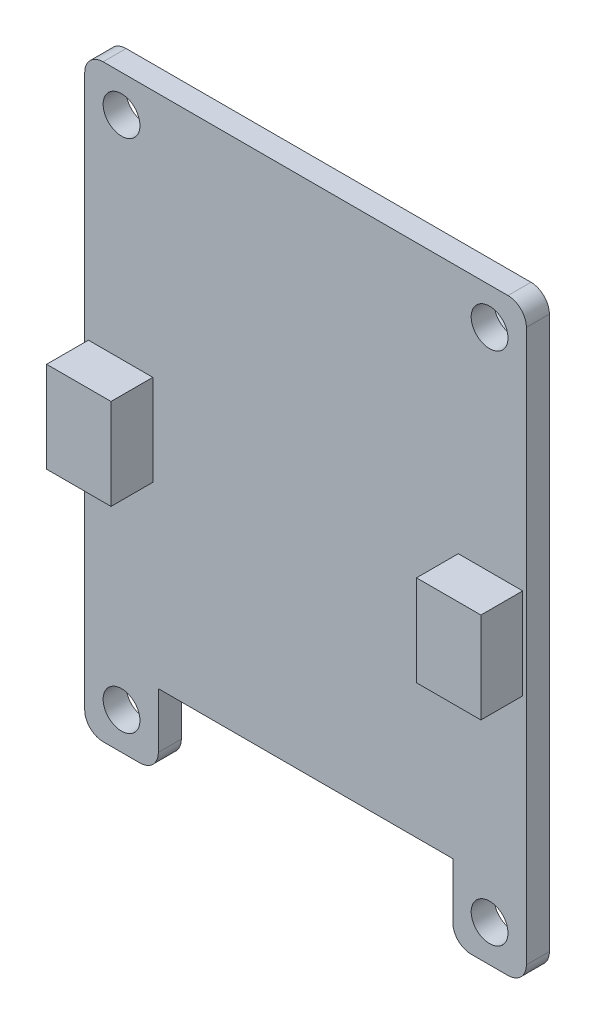
ISO-10303-21;
HEADER;
FILE_DESCRIPTION(('STEP AP214'),'2;1');
FILE_NAME('part.step','',(''),(''),'','','');
FILE_SCHEMA(('AUTOMOTIVE_DESIGN { 1 0 10303 214 1 1 1 1 }'));
ENDSEC;
DATA;
#1=APPLICATION_CONTEXT('core data for automotive mechanical design processes');
#2=APPLICATION_PROTOCOL_DEFINITION('international standard','automotive_design',2000,#1);
#3=PRODUCT_CONTEXT('',#1,'mechanical');
#4=PRODUCT('Part','Part','',(#3));
#5=PRODUCT_RELATED_PRODUCT_CATEGORY('part','',(#4));
#6=PRODUCT_DEFINITION_FORMATION('','',#4);
#7=PRODUCT_DEFINITION_CONTEXT('part definition',#1,'design');
#8=PRODUCT_DEFINITION('design','',#6,#7);
#9=PRODUCT_DEFINITION_SHAPE('','',#8);
#10=(LENGTH_UNIT() NAMED_UNIT(*) SI_UNIT(.MILLI.,.METRE.));
#11=(NAMED_UNIT(*) PLANE_ANGLE_UNIT() SI_UNIT($,.RADIAN.));
#12=(NAMED_UNIT(*) SI_UNIT($,.STERADIAN.) SOLID_ANGLE_UNIT());
#13=UNCERTAINTY_MEASURE_WITH_UNIT(LENGTH_MEASURE(1.E-05),#10,'distance_accuracy_value','');
#14=(GEOMETRIC_REPRESENTATION_CONTEXT(3) GLOBAL_UNCERTAINTY_ASSIGNED_CONTEXT((#13)) GLOBAL_UNIT_ASSIGNED_CONTEXT((#10,
#11,#12)) REPRESENTATION_CONTEXT('',''));
#15=CARTESIAN_POINT('',(0.,0.,0.));
#16=DIRECTION('',(0.,0.,1.));
#17=DIRECTION('',(1.,0.,0.));
#18=AXIS2_PLACEMENT_3D('',#15,#16,#17);
#19=CARTESIAN_POINT('',(0.,0.,1.5875));
#20=DIRECTION('',(0.,0.,-1.));
#21=DIRECTION('',(-1.,0.,0.));
#22=AXIS2_PLACEMENT_3D('',#19,#20,#21);
#23=PLANE('',#22);
#24=DIRECTION('',(0.,1.,0.));
#25=VECTOR('',#24,1.);
#26=CARTESIAN_POINT('',(-10.541,3.175,1.5875));
#27=LINE('',#26,#25);
#28=CARTESIAN_POINT('',(-10.541,-3.0988,1.5875));
#29=VERTEX_POINT('',#28);
#30=CARTESIAN_POINT('',(-10.541,3.175,1.5875));
#31=VERTEX_POINT('',#30);
#32=EDGE_CURVE('E221',#29,#31,#27,.T.);
#33=ORIENTED_EDGE('',*,*,#32,.F.);
#34=DIRECTION('',(1.,0.,0.));
#35=VECTOR('',#34,1.);
#36=CARTESIAN_POINT('',(-14.986,-3.0988,1.5875));
#37=LINE('',#36,#35);
#38=CARTESIAN_POINT('',(-14.986,-3.0988,1.5875));
#39=VERTEX_POINT('',#38);
#40=EDGE_CURVE('E264',#39,#29,#37,.T.);
#41=ORIENTED_EDGE('',*,*,#40,.F.);
#42=DIRECTION('',(0.,-1.,0.));
#43=VECTOR('',#42,1.);
#44=CARTESIAN_POINT('',(-14.986,3.175,1.5875));
#45=LINE('',#44,#43);
#46=CARTESIAN_POINT('',(-14.986,3.175,1.5875));
#47=VERTEX_POINT('',#46);
#48=EDGE_CURVE('E281',#47,#39,#45,.T.);
#49=ORIENTED_EDGE('',*,*,#48,.F.);
#50=DIRECTION('',(-1.,0.,0.));
#51=VECTOR('',#50,1.);
#52=CARTESIAN_POINT('',(-14.986,3.175,1.5875));
#53=LINE('',#52,#51);
#54=EDGE_CURVE('E277',#31,#47,#53,.T.);
#55=ORIENTED_EDGE('',*,*,#54,.F.);
#56=EDGE_LOOP('',(#33,#41,#49,#55));
#57=FACE_BOUND('',#56,.T.);
#58=DIRECTION('',(0.,-1.,0.));
#59=VECTOR('',#58,1.);
#60=CARTESIAN_POINT('',(10.16,-20.32,1.5875));
#61=LINE('',#60,#59);
#62=CARTESIAN_POINT('',(10.16,-15.24,1.5875));
#63=VERTEX_POINT('',#62);
#64=CARTESIAN_POINT('',(10.16,-19.05,1.5875));
#65=VERTEX_POINT('',#64);
#66=EDGE_CURVE('E394',#63,#65,#61,.T.);
#67=ORIENTED_EDGE('',*,*,#66,.T.);
#68=CARTESIAN_POINT('',(11.43,-19.05,1.5875));
#69=DIRECTION('',(0.,0.,-1.));
#70=DIRECTION('',(-1.,0.,0.));
#71=AXIS2_PLACEMENT_3D('',#68,#69,#70);
#72=CIRCLE('',#71,1.27);
#73=CARTESIAN_POINT('',(11.43,-20.32,1.5875));
#74=VERTEX_POINT('',#73);
#75=EDGE_CURVE('E486',#65,#74,#72,.F.);
#76=ORIENTED_EDGE('',*,*,#75,.T.);
#77=DIRECTION('',(1.,0.,0.));
#78=VECTOR('',#77,1.);
#79=CARTESIAN_POINT('',(15.24,-20.32,1.5875));
#80=LINE('',#79,#78);
#81=CARTESIAN_POINT('',(13.97,-20.32,1.5875));
#82=VERTEX_POINT('',#81);
#83=EDGE_CURVE('E398',#74,#82,#80,.T.);
#84=ORIENTED_EDGE('',*,*,#83,.T.);
#85=CARTESIAN_POINT('',(13.97,-19.05,1.5875));
#86=DIRECTION('',(0.,0.,-1.));
#87=DIRECTION('',(-1.,0.,0.));
#88=AXIS2_PLACEMENT_3D('',#85,#86,#87);
#89=CIRCLE('',#88,1.27);
#90=CARTESIAN_POINT('',(15.24,-19.05,1.5875));
#91=VERTEX_POINT('',#90);
#92=EDGE_CURVE('E474',#82,#91,#89,.F.);
#93=ORIENTED_EDGE('',*,*,#92,.T.);
#94=DIRECTION('',(0.,1.,0.));
#95=VECTOR('',#94,1.);
#96=CARTESIAN_POINT('',(15.24,20.32,1.5875));
#97=LINE('',#96,#95);
#98=CARTESIAN_POINT('',(15.24,19.05,1.5875));
#99=VERTEX_POINT('',#98);
#100=EDGE_CURVE('E402',#91,#99,#97,.T.);
#101=ORIENTED_EDGE('',*,*,#100,.T.);
#102=CARTESIAN_POINT('',(13.97,19.05,1.5875));
#103=DIRECTION('',(0.,0.,-1.));
#104=DIRECTION('',(-1.,0.,0.));
#105=AXIS2_PLACEMENT_3D('',#102,#103,#104);
#106=CIRCLE('',#105,1.27);
#107=CARTESIAN_POINT('',(13.97,20.32,1.5875));
#108=VERTEX_POINT('',#107);
#109=EDGE_CURVE('E471',#99,#108,#106,.F.);
#110=ORIENTED_EDGE('',*,*,#109,.T.);
#111=DIRECTION('',(-1.,0.,0.));
#112=VECTOR('',#111,1.);
#113=CARTESIAN_POINT('',(-15.24,20.32,1.5875));
#114=LINE('',#113,#112);
#115=CARTESIAN_POINT('',(-13.97,20.32,1.5875));
#116=VERTEX_POINT('',#115);
#117=EDGE_CURVE('E406',#108,#116,#114,.T.);
#118=ORIENTED_EDGE('',*,*,#117,.T.);
#119=CARTESIAN_POINT('',(-13.97,19.05,1.5875));
#120=DIRECTION('',(0.,0.,-1.));
#121=DIRECTION('',(-1.,0.,0.));
#122=AXIS2_PLACEMENT_3D('',#119,#120,#121);
#123=CIRCLE('',#122,1.27);
#124=CARTESIAN_POINT('',(-15.24,19.05,1.5875));
#125=VERTEX_POINT('',#124);
#126=EDGE_CURVE('E480',#116,#125,#123,.F.);
#127=ORIENTED_EDGE('',*,*,#126,.T.);
#128=DIRECTION('',(0.,-1.,0.));
#129=VECTOR('',#128,1.);
#130=CARTESIAN_POINT('',(-15.24,-20.32,1.5875));
#131=LINE('',#130,#129);
#132=CARTESIAN_POINT('',(-15.24,-19.05,1.5875));
#133=VERTEX_POINT('',#132);
#134=EDGE_CURVE('E379',#125,#133,#131,.T.);
#135=ORIENTED_EDGE('',*,*,#134,.T.);
#136=CARTESIAN_POINT('',(-13.97,-19.05,1.5875));
#137=DIRECTION('',(0.,0.,-1.));
#138=DIRECTION('',(-1.,0.,0.));
#139=AXIS2_PLACEMENT_3D('',#136,#137,#138);
#140=CIRCLE('',#139,1.27);
#141=CARTESIAN_POINT('',(-13.97,-20.32,1.5875));
#142=VERTEX_POINT('',#141);
#143=EDGE_CURVE('E477',#133,#142,#140,.F.);
#144=ORIENTED_EDGE('',*,*,#143,.T.);
#145=DIRECTION('',(1.,0.,0.));
#146=VECTOR('',#145,1.);
#147=CARTESIAN_POINT('',(-10.16,-20.32,1.5875));
#148=LINE('',#147,#146);
#149=CARTESIAN_POINT('',(-11.43,-20.32,1.5875));
#150=VERTEX_POINT('',#149);
#151=EDGE_CURVE('E383',#142,#150,#148,.T.);
#152=ORIENTED_EDGE('',*,*,#151,.T.);
#153=CARTESIAN_POINT('',(-11.43,-19.05,1.5875));
#154=DIRECTION('',(0.,0.,-1.));
#155=DIRECTION('',(-1.,0.,0.));
#156=AXIS2_PLACEMENT_3D('',#153,#154,#155);
#157=CIRCLE('',#156,1.27);
#158=CARTESIAN_POINT('',(-10.16,-19.05,1.5875));
#159=VERTEX_POINT('',#158);
#160=EDGE_CURVE('E483',#150,#159,#157,.F.);
#161=ORIENTED_EDGE('',*,*,#160,.T.);
#162=DIRECTION('',(0.,1.,0.));
#163=VECTOR('',#162,1.);
#164=CARTESIAN_POINT('',(-10.16,-15.24,1.5875));
#165=LINE('',#164,#163);
#166=CARTESIAN_POINT('',(-10.16,-15.24,1.5875));
#167=VERTEX_POINT('',#166);
#168=EDGE_CURVE('E388',#159,#167,#165,.T.);
#169=ORIENTED_EDGE('',*,*,#168,.T.);
#170=DIRECTION('',(1.,0.,0.));
#171=VECTOR('',#170,1.);
#172=CARTESIAN_POINT('',(10.16,-15.24,1.5875));
#173=LINE('',#172,#171);
#174=EDGE_CURVE('E391',#167,#63,#173,.T.);
#175=ORIENTED_EDGE('',*,*,#174,.T.);
#176=EDGE_LOOP('',(#67,#76,#84,#93,#101,#110,#118,#127,#135,#144,#152,#161,#169,#175));
#177=FACE_BOUND('',#176,.T.);
#178=CARTESIAN_POINT('',(-12.7,-17.78,1.5875));
#179=DIRECTION('',(0.,0.,1.));
#180=DIRECTION('',(1.,0.,0.));
#181=AXIS2_PLACEMENT_3D('',#178,#179,#180);
#182=CIRCLE('',#181,1.27);
#183=CARTESIAN_POINT('',(-11.43,-17.78,1.5875));
#184=VERTEX_POINT('',#183);
#185=EDGE_CURVE('E371',#184,#184,#182,.T.);
#186=ORIENTED_EDGE('',*,*,#185,.F.);
#187=EDGE_LOOP('',(#186));
#188=FACE_BOUND('',#187,.T.);
#189=CARTESIAN_POINT('',(12.7,-17.78,1.5875));
#190=DIRECTION('',(0.,0.,1.));
#191=DIRECTION('',(1.,0.,0.));
#192=AXIS2_PLACEMENT_3D('',#189,#190,#191);
#193=CIRCLE('',#192,1.27);
#194=CARTESIAN_POINT('',(13.97,-17.78,1.5875));
#195=VERTEX_POINT('',#194);
#196=EDGE_CURVE('E363',#195,#195,#193,.T.);
#197=ORIENTED_EDGE('',*,*,#196,.F.);
#198=EDGE_LOOP('',(#197));
#199=FACE_BOUND('',#198,.T.);
#200=CARTESIAN_POINT('',(-12.7,17.78,1.5875));
#201=DIRECTION('',(0.,0.,1.));
#202=DIRECTION('',(1.,0.,0.));
#203=AXIS2_PLACEMENT_3D('',#200,#201,#202);
#204=CIRCLE('',#203,1.27);
#205=CARTESIAN_POINT('',(-11.43,17.78,1.5875));
#206=VERTEX_POINT('',#205);
#207=EDGE_CURVE('E355',#206,#206,#204,.T.);
#208=ORIENTED_EDGE('',*,*,#207,.F.);
#209=EDGE_LOOP('',(#208));
#210=FACE_BOUND('',#209,.T.);
#211=CARTESIAN_POINT('',(12.7,17.78,1.5875));
#212=DIRECTION('',(0.,0.,1.));
#213=DIRECTION('',(1.,0.,0.));
#214=AXIS2_PLACEMENT_3D('',#211,#212,#213);
#215=CIRCLE('',#214,1.27);
#216=CARTESIAN_POINT('',(13.97,17.78,1.5875));
#217=VERTEX_POINT('',#216);
#218=EDGE_CURVE('E347',#217,#217,#215,.T.);
#219=ORIENTED_EDGE('',*,*,#218,.F.);
#220=EDGE_LOOP('',(#219));
#221=FACE_BOUND('',#220,.T.);
#222=DIRECTION('',(0.,1.,0.));
#223=VECTOR('',#222,1.);
#224=CARTESIAN_POINT('',(14.986,3.175,1.5875));
#225=LINE('',#224,#223);
#226=CARTESIAN_POINT('',(14.986,-3.0988,1.5875));
#227=VERTEX_POINT('',#226);
#228=CARTESIAN_POINT('',(14.986,3.175,1.5875));
#229=VERTEX_POINT('',#228);
#230=EDGE_CURVE('E214',#227,#229,#225,.T.);
#231=ORIENTED_EDGE('',*,*,#230,.F.);
#232=DIRECTION('',(1.,0.,0.));
#233=VECTOR('',#232,1.);
#234=CARTESIAN_POINT('',(10.541,-3.0988,1.5875));
#235=LINE('',#234,#233);
#236=CARTESIAN_POINT('',(10.541,-3.0988,1.5875));
#237=VERTEX_POINT('',#236);
#238=EDGE_CURVE('E216',#237,#227,#235,.T.);
#239=ORIENTED_EDGE('',*,*,#238,.F.);
#240=DIRECTION('',(0.,-1.,0.));
#241=VECTOR('',#240,1.);
#242=CARTESIAN_POINT('',(10.541,3.175,1.5875));
#243=LINE('',#242,#241);
#244=CARTESIAN_POINT('',(10.541,3.175,1.5875));
#245=VERTEX_POINT('',#244);
#246=EDGE_CURVE('E65',#245,#237,#243,.T.);
#247=ORIENTED_EDGE('',*,*,#246,.F.);
#248=DIRECTION('',(-1.,0.,0.));
#249=VECTOR('',#248,1.);
#250=CARTESIAN_POINT('',(10.541,3.175,1.5875));
#251=LINE('',#250,#249);
#252=EDGE_CURVE('E60',#229,#245,#251,.T.);
#253=ORIENTED_EDGE('',*,*,#252,.F.);
#254=EDGE_LOOP('',(#231,#239,#247,#253));
#255=FACE_BOUND('',#254,.T.);
#256=ADVANCED_FACE('F42',(#57,#177,#188,#199,#210,#221,#255),#23,.F.);
#257=CARTESIAN_POINT('',(0.,0.,0.));
#258=DIRECTION('',(0.,0.,-1.));
#259=DIRECTION('',(-1.,0.,0.));
#260=AXIS2_PLACEMENT_3D('',#257,#258,#259);
#261=PLANE('',#260);
#262=DIRECTION('',(-1.,0.,0.));
#263=VECTOR('',#262,1.);
#264=CARTESIAN_POINT('',(12.827,-15.24,0.));
#265=LINE('',#264,#263);
#266=CARTESIAN_POINT('',(-10.16,-15.24,0.));
#267=VERTEX_POINT('',#266);
#268=CARTESIAN_POINT('',(-12.827,-15.24,0.));
#269=VERTEX_POINT('',#268);
#270=EDGE_CURVE('E11',#267,#269,#265,.T.);
#271=ORIENTED_EDGE('',*,*,#270,.F.);
#272=DIRECTION('',(0.,1.,0.));
#273=VECTOR('',#272,1.);
#274=CARTESIAN_POINT('',(-10.16,-15.24,0.));
#275=LINE('',#274,#273);
#276=CARTESIAN_POINT('',(-10.16,-19.05,0.));
#277=VERTEX_POINT('',#276);
#278=EDGE_CURVE('E418',#277,#267,#275,.T.);
#279=ORIENTED_EDGE('',*,*,#278,.F.);
#280=CARTESIAN_POINT('',(-11.43,-19.05,0.));
#281=DIRECTION('',(0.,0.,-1.));
#282=DIRECTION('',(-1.,0.,0.));
#283=AXIS2_PLACEMENT_3D('',#280,#281,#282);
#284=CIRCLE('',#283,1.27);
#285=CARTESIAN_POINT('',(-11.43,-20.32,0.));
#286=VERTEX_POINT('',#285);
#287=EDGE_CURVE('E462',#277,#286,#284,.T.);
#288=ORIENTED_EDGE('',*,*,#287,.T.);
#289=DIRECTION('',(1.,0.,0.));
#290=VECTOR('',#289,1.);
#291=CARTESIAN_POINT('',(-10.16,-20.32,0.));
#292=LINE('',#291,#290);
#293=CARTESIAN_POINT('',(-13.97,-20.32,0.));
#294=VERTEX_POINT('',#293);
#295=EDGE_CURVE('E414',#294,#286,#292,.T.);
#296=ORIENTED_EDGE('',*,*,#295,.F.);
#297=CARTESIAN_POINT('',(-13.97,-19.05,0.));
#298=DIRECTION('',(0.,0.,-1.));
#299=DIRECTION('',(-1.,0.,0.));
#300=AXIS2_PLACEMENT_3D('',#297,#298,#299);
#301=CIRCLE('',#300,1.27);
#302=CARTESIAN_POINT('',(-15.24,-19.05,0.));
#303=VERTEX_POINT('',#302);
#304=EDGE_CURVE('E456',#294,#303,#301,.T.);
#305=ORIENTED_EDGE('',*,*,#304,.T.);
#306=DIRECTION('',(0.,-1.,0.));
#307=VECTOR('',#306,1.);
#308=CARTESIAN_POINT('',(-15.24,-20.32,0.));
#309=LINE('',#308,#307);
#310=CARTESIAN_POINT('',(-15.24,19.05,0.));
#311=VERTEX_POINT('',#310);
#312=EDGE_CURVE('E375',#311,#303,#309,.T.);
#313=ORIENTED_EDGE('',*,*,#312,.F.);
#314=CARTESIAN_POINT('',(-13.97,19.05,0.));
#315=DIRECTION('',(0.,0.,-1.));
#316=DIRECTION('',(-1.,0.,0.));
#317=AXIS2_PLACEMENT_3D('',#314,#315,#316);
#318=CIRCLE('',#317,1.27);
#319=CARTESIAN_POINT('',(-13.97,20.32,0.));
#320=VERTEX_POINT('',#319);
#321=EDGE_CURVE('E459',#311,#320,#318,.T.);
#322=ORIENTED_EDGE('',*,*,#321,.T.);
#323=DIRECTION('',(-1.,0.,0.));
#324=VECTOR('',#323,1.);
#325=CARTESIAN_POINT('',(-15.24,20.32,0.));
#326=LINE('',#325,#324);
#327=CARTESIAN_POINT('',(13.97,20.32,0.));
#328=VERTEX_POINT('',#327);
#329=EDGE_CURVE('E384',#328,#320,#326,.T.);
#330=ORIENTED_EDGE('',*,*,#329,.F.);
#331=CARTESIAN_POINT('',(13.97,19.05,0.));
#332=DIRECTION('',(0.,0.,-1.));
#333=DIRECTION('',(-1.,0.,0.));
#334=AXIS2_PLACEMENT_3D('',#331,#332,#333);
#335=CIRCLE('',#334,1.27);
#336=CARTESIAN_POINT('',(15.24,19.05,0.));
#337=VERTEX_POINT('',#336);
#338=EDGE_CURVE('E450',#328,#337,#335,.T.);
#339=ORIENTED_EDGE('',*,*,#338,.T.);
#340=DIRECTION('',(0.,1.,0.));
#341=VECTOR('',#340,1.);
#342=CARTESIAN_POINT('',(15.24,20.32,0.));
#343=LINE('',#342,#341);
#344=CARTESIAN_POINT('',(15.24,-19.05,0.));
#345=VERTEX_POINT('',#344);
#346=EDGE_CURVE('E430',#345,#337,#343,.T.);
#347=ORIENTED_EDGE('',*,*,#346,.F.);
#348=CARTESIAN_POINT('',(13.97,-19.05,0.));
#349=DIRECTION('',(0.,0.,-1.));
#350=DIRECTION('',(-1.,0.,0.));
#351=AXIS2_PLACEMENT_3D('',#348,#349,#350);
#352=CIRCLE('',#351,1.27);
#353=CARTESIAN_POINT('',(13.97,-20.32,0.));
#354=VERTEX_POINT('',#353);
#355=EDGE_CURVE('E453',#345,#354,#352,.T.);
#356=ORIENTED_EDGE('',*,*,#355,.T.);
#357=DIRECTION('',(1.,0.,0.));
#358=VECTOR('',#357,1.);
#359=CARTESIAN_POINT('',(15.24,-20.32,0.));
#360=LINE('',#359,#358);
#361=CARTESIAN_POINT('',(11.43,-20.32,0.));
#362=VERTEX_POINT('',#361);
#363=EDGE_CURVE('E426',#362,#354,#360,.T.);
#364=ORIENTED_EDGE('',*,*,#363,.F.);
#365=CARTESIAN_POINT('',(11.43,-19.05,0.));
#366=DIRECTION('',(0.,0.,-1.));
#367=DIRECTION('',(-1.,0.,0.));
#368=AXIS2_PLACEMENT_3D('',#365,#366,#367);
#369=CIRCLE('',#368,1.27);
#370=CARTESIAN_POINT('',(10.16,-19.05,0.));
#371=VERTEX_POINT('',#370);
#372=EDGE_CURVE('E465',#362,#371,#369,.T.);
#373=ORIENTED_EDGE('',*,*,#372,.T.);
#374=DIRECTION('',(0.,-1.,0.));
#375=VECTOR('',#374,1.);
#376=CARTESIAN_POINT('',(10.16,-20.32,0.));
#377=LINE('',#376,#375);
#378=CARTESIAN_POINT('',(10.16,-15.24,0.));
#379=VERTEX_POINT('',#378);
#380=EDGE_CURVE('E422',#379,#371,#377,.T.);
#381=ORIENTED_EDGE('',*,*,#380,.F.);
#382=CARTESIAN_POINT('',(12.827,-15.24,0.));
#383=VERTEX_POINT('',#382);
#384=EDGE_CURVE('E53',#383,#379,#265,.T.);
#385=ORIENTED_EDGE('',*,*,#384,.F.);
#386=DIRECTION('',(0.,-1.,0.));
#387=VECTOR('',#386,1.);
#388=CARTESIAN_POINT('',(12.827,15.24,0.));
#389=LINE('',#388,#387);
#390=CARTESIAN_POINT('',(12.827,15.24,0.));
#391=VERTEX_POINT('',#390);
#392=EDGE_CURVE('E325',#391,#383,#389,.T.);
#393=ORIENTED_EDGE('',*,*,#392,.F.);
#394=DIRECTION('',(1.,0.,0.));
#395=VECTOR('',#394,1.);
#396=CARTESIAN_POINT('',(-12.827,15.24,0.));
#397=LINE('',#396,#395);
#398=CARTESIAN_POINT('',(-12.827,15.24,0.));
#399=VERTEX_POINT('',#398);
#400=EDGE_CURVE('E321',#399,#391,#397,.T.);
#401=ORIENTED_EDGE('',*,*,#400,.F.);
#402=DIRECTION('',(0.,1.,0.));
#403=VECTOR('',#402,1.);
#404=CARTESIAN_POINT('',(-12.827,-15.24,0.));
#405=LINE('',#404,#403);
#406=EDGE_CURVE('E303',#269,#399,#405,.T.);
#407=ORIENTED_EDGE('',*,*,#406,.F.);
#408=EDGE_LOOP('',(#271,#279,#288,#296,#305,#313,#322,#330,#339,#347,#356,#364,#373,#381,#385,
#393,#401,#407));
#409=FACE_BOUND('',#408,.T.);
#410=CARTESIAN_POINT('',(-12.7,17.78,0.));
#411=DIRECTION('',(0.,0.,1.));
#412=DIRECTION('',(1.,0.,0.));
#413=AXIS2_PLACEMENT_3D('',#410,#411,#412);
#414=CIRCLE('',#413,1.27);
#415=CARTESIAN_POINT('',(-11.43,17.78,0.));
#416=VERTEX_POINT('',#415);
#417=EDGE_CURVE('E351',#416,#416,#414,.T.);
#418=ORIENTED_EDGE('',*,*,#417,.T.);
#419=EDGE_LOOP('',(#418));
#420=FACE_BOUND('',#419,.T.);
#421=CARTESIAN_POINT('',(-12.7,-17.78,0.));
#422=DIRECTION('',(0.,0.,1.));
#423=DIRECTION('',(1.,0.,0.));
#424=AXIS2_PLACEMENT_3D('',#421,#422,#423);
#425=CIRCLE('',#424,1.27);
#426=CARTESIAN_POINT('',(-11.43,-17.78,0.));
#427=VERTEX_POINT('',#426);
#428=EDGE_CURVE('E367',#427,#427,#425,.T.);
#429=ORIENTED_EDGE('',*,*,#428,.T.);
#430=EDGE_LOOP('',(#429));
#431=FACE_BOUND('',#430,.T.);
#432=CARTESIAN_POINT('',(12.7,-17.78,0.));
#433=DIRECTION('',(0.,0.,1.));
#434=DIRECTION('',(1.,0.,0.));
#435=AXIS2_PLACEMENT_3D('',#432,#433,#434);
#436=CIRCLE('',#435,1.27);
#437=CARTESIAN_POINT('',(13.97,-17.78,0.));
#438=VERTEX_POINT('',#437);
#439=EDGE_CURVE('E359',#438,#438,#436,.T.);
#440=ORIENTED_EDGE('',*,*,#439,.T.);
#441=EDGE_LOOP('',(#440));
#442=FACE_BOUND('',#441,.T.);
#443=CARTESIAN_POINT('',(12.7,17.78,0.));
#444=DIRECTION('',(0.,0.,1.));
#445=DIRECTION('',(1.,0.,0.));
#446=AXIS2_PLACEMENT_3D('',#443,#444,#445);
#447=CIRCLE('',#446,1.27);
#448=CARTESIAN_POINT('',(13.97,17.78,0.));
#449=VERTEX_POINT('',#448);
#450=EDGE_CURVE('E346',#449,#449,#447,.T.);
#451=ORIENTED_EDGE('',*,*,#450,.T.);
#452=EDGE_LOOP('',(#451));
#453=FACE_BOUND('',#452,.T.);
#454=ADVANCED_FACE('F526',(#409,#420,#431,#442,#453),#261,.T.);
#455=CARTESIAN_POINT('',(-15.24,-20.32,1.5875));
#456=DIRECTION('',(1.,0.,0.));
#457=DIRECTION('',(0.,1.,0.));
#458=AXIS2_PLACEMENT_3D('',#455,#456,#457);
#459=PLANE('',#458);
#460=ORIENTED_EDGE('',*,*,#134,.F.);
#461=DIRECTION('',(0.,0.,-1.));
#462=VECTOR('',#461,1.);
#463=CARTESIAN_POINT('',(-15.24,19.05,1.5875));
#464=LINE('',#463,#462);
#465=EDGE_CURVE('E503',#125,#311,#464,.T.);
#466=ORIENTED_EDGE('',*,*,#465,.T.);
#467=ORIENTED_EDGE('',*,*,#312,.T.);
#468=DIRECTION('',(0.,0.,-1.));
#469=VECTOR('',#468,1.);
#470=CARTESIAN_POINT('',(-15.24,-19.05,1.5875));
#471=LINE('',#470,#469);
#472=EDGE_CURVE('E500',#303,#133,#471,.F.);
#473=ORIENTED_EDGE('',*,*,#472,.T.);
#474=EDGE_LOOP('',(#460,#466,#467,#473));
#475=FACE_BOUND('',#474,.T.);
#476=ADVANCED_FACE('F546',(#475),#459,.F.);
#477=CARTESIAN_POINT('',(-10.16,-20.32,1.5875));
#478=DIRECTION('',(0.,1.,0.));
#479=DIRECTION('',(0.,0.,1.));
#480=AXIS2_PLACEMENT_3D('',#477,#478,#479);
#481=PLANE('',#480);
#482=ORIENTED_EDGE('',*,*,#295,.T.);
#483=DIRECTION('',(0.,0.,-1.));
#484=VECTOR('',#483,1.);
#485=CARTESIAN_POINT('',(-11.43,-20.32,1.5875));
#486=LINE('',#485,#484);
#487=EDGE_CURVE('E497',#286,#150,#486,.F.);
#488=ORIENTED_EDGE('',*,*,#487,.T.);
#489=ORIENTED_EDGE('',*,*,#151,.F.);
#490=DIRECTION('',(0.,0.,-1.));
#491=VECTOR('',#490,1.);
#492=CARTESIAN_POINT('',(-13.97,-20.32,1.5875));
#493=LINE('',#492,#491);
#494=EDGE_CURVE('E493',#142,#294,#493,.T.);
#495=ORIENTED_EDGE('',*,*,#494,.T.);
#496=EDGE_LOOP('',(#482,#488,#489,#495));
#497=FACE_BOUND('',#496,.T.);
#498=ADVANCED_FACE('F555',(#497),#481,.F.);
#499=CARTESIAN_POINT('',(-10.16,-15.24,1.5875));
#500=DIRECTION('',(-1.,0.,0.));
#501=DIRECTION('',(0.,-1.,0.));
#502=AXIS2_PLACEMENT_3D('',#499,#500,#501);
#503=PLANE('',#502);
#504=ORIENTED_EDGE('',*,*,#168,.F.);
#505=DIRECTION('',(0.,0.,-1.));
#506=VECTOR('',#505,1.);
#507=CARTESIAN_POINT('',(-10.16,-19.05,1.5875));
#508=LINE('',#507,#506);
#509=EDGE_CURVE('E489',#159,#277,#508,.T.);
#510=ORIENTED_EDGE('',*,*,#509,.T.);
#511=ORIENTED_EDGE('',*,*,#278,.T.);
#512=DIRECTION('',(0.,0.,-1.));
#513=VECTOR('',#512,1.);
#514=CARTESIAN_POINT('',(-10.16,-15.24,1.5875));
#515=LINE('',#514,#513);
#516=EDGE_CURVE('E439',#167,#267,#515,.T.);
#517=ORIENTED_EDGE('',*,*,#516,.F.);
#518=EDGE_LOOP('',(#504,#510,#511,#517));
#519=FACE_BOUND('',#518,.T.);
#520=ADVANCED_FACE('F564',(#519),#503,.F.);
#521=CARTESIAN_POINT('',(10.16,-15.24,1.5875));
#522=DIRECTION('',(0.,1.,0.));
#523=DIRECTION('',(0.,0.,1.));
#524=AXIS2_PLACEMENT_3D('',#521,#522,#523);
#525=PLANE('',#524);
#526=ORIENTED_EDGE('',*,*,#516,.T.);
#527=ORIENTED_EDGE('',*,*,#270,.T.);
#528=DIRECTION('',(0.,0.,1.));
#529=VECTOR('',#528,1.);
#530=CARTESIAN_POINT('',(-12.827,-15.24,-2.3749));
#531=LINE('',#530,#529);
#532=CARTESIAN_POINT('',(-12.827,-15.24,-2.3749));
#533=VERTEX_POINT('',#532);
#534=EDGE_CURVE('E317',#533,#269,#531,.T.);
#535=ORIENTED_EDGE('',*,*,#534,.F.);
#536=DIRECTION('',(-1.,0.,0.));
#537=VECTOR('',#536,1.);
#538=CARTESIAN_POINT('',(12.827,-15.24,-2.3749));
#539=LINE('',#538,#537);
#540=CARTESIAN_POINT('',(12.827,-15.24,-2.3749));
#541=VERTEX_POINT('',#540);
#542=EDGE_CURVE('E314',#541,#533,#539,.T.);
#543=ORIENTED_EDGE('',*,*,#542,.F.);
#544=DIRECTION('',(0.,0.,1.));
#545=VECTOR('',#544,1.);
#546=CARTESIAN_POINT('',(12.827,-15.24,-2.3749));
#547=LINE('',#546,#545);
#548=EDGE_CURVE('E334',#541,#383,#547,.T.);
#549=ORIENTED_EDGE('',*,*,#548,.T.);
#550=ORIENTED_EDGE('',*,*,#384,.T.);
#551=DIRECTION('',(0.,0.,-1.));
#552=VECTOR('',#551,1.);
#553=CARTESIAN_POINT('',(10.16,-15.24,1.5875));
#554=LINE('',#553,#552);
#555=EDGE_CURVE('E410',#63,#379,#554,.T.);
#556=ORIENTED_EDGE('',*,*,#555,.F.);
#557=ORIENTED_EDGE('',*,*,#174,.F.);
#558=EDGE_LOOP('',(#526,#527,#535,#543,#549,#550,#556,#557));
#559=FACE_BOUND('',#558,.T.);
#560=ADVANCED_FACE('F568',(#559),#525,.F.);
#561=CARTESIAN_POINT('',(10.16,-20.32,1.5875));
#562=DIRECTION('',(1.,0.,0.));
#563=DIRECTION('',(0.,1.,0.));
#564=AXIS2_PLACEMENT_3D('',#561,#562,#563);
#565=PLANE('',#564);
#566=ORIENTED_EDGE('',*,*,#380,.T.);
#567=DIRECTION('',(0.,0.,-1.));
#568=VECTOR('',#567,1.);
#569=CARTESIAN_POINT('',(10.16,-19.05,1.5875));
#570=LINE('',#569,#568);
#571=EDGE_CURVE('E468',#371,#65,#570,.F.);
#572=ORIENTED_EDGE('',*,*,#571,.T.);
#573=ORIENTED_EDGE('',*,*,#66,.F.);
#574=ORIENTED_EDGE('',*,*,#555,.T.);
#575=EDGE_LOOP('',(#566,#572,#573,#574));
#576=FACE_BOUND('',#575,.T.);
#577=ADVANCED_FACE('F612',(#576),#565,.F.);
#578=CARTESIAN_POINT('',(15.24,-20.32,1.5875));
#579=DIRECTION('',(0.,1.,0.));
#580=DIRECTION('',(0.,0.,1.));
#581=AXIS2_PLACEMENT_3D('',#578,#579,#580);
#582=PLANE('',#581);
#583=ORIENTED_EDGE('',*,*,#83,.F.);
#584=DIRECTION('',(0.,0.,-1.));
#585=VECTOR('',#584,1.);
#586=CARTESIAN_POINT('',(11.43,-20.32,1.5875));
#587=LINE('',#586,#585);
#588=EDGE_CURVE('E446',#74,#362,#587,.T.);
#589=ORIENTED_EDGE('',*,*,#588,.T.);
#590=ORIENTED_EDGE('',*,*,#363,.T.);
#591=DIRECTION('',(0.,0.,-1.));
#592=VECTOR('',#591,1.);
#593=CARTESIAN_POINT('',(13.97,-20.32,1.5875));
#594=LINE('',#593,#592);
#595=EDGE_CURVE('E443',#354,#82,#594,.F.);
#596=ORIENTED_EDGE('',*,*,#595,.T.);
#597=EDGE_LOOP('',(#583,#589,#590,#596));
#598=FACE_BOUND('',#597,.T.);
#599=ADVANCED_FACE('F609',(#598),#582,.F.);
#600=CARTESIAN_POINT('',(15.24,20.32,1.5875));
#601=DIRECTION('',(-1.,0.,0.));
#602=DIRECTION('',(0.,-1.,0.));
#603=AXIS2_PLACEMENT_3D('',#600,#601,#602);
#604=PLANE('',#603);
#605=ORIENTED_EDGE('',*,*,#100,.F.);
#606=DIRECTION('',(0.,0.,-1.));
#607=VECTOR('',#606,1.);
#608=CARTESIAN_POINT('',(15.24,-19.05,1.5875));
#609=LINE('',#608,#607);
#610=EDGE_CURVE('E46',#91,#345,#609,.T.);
#611=ORIENTED_EDGE('',*,*,#610,.T.);
#612=ORIENTED_EDGE('',*,*,#346,.T.);
#613=DIRECTION('',(0.,0.,-1.));
#614=VECTOR('',#613,1.);
#615=CARTESIAN_POINT('',(15.24,19.05,1.5875));
#616=LINE('',#615,#614);
#617=EDGE_CURVE('E513',#337,#99,#616,.F.);
#618=ORIENTED_EDGE('',*,*,#617,.T.);
#619=EDGE_LOOP('',(#605,#611,#612,#618));
#620=FACE_BOUND('',#619,.T.);
#621=ADVANCED_FACE('F522',(#620),#604,.F.);
#622=CARTESIAN_POINT('',(-15.24,20.32,1.5875));
#623=DIRECTION('',(0.,-1.,0.));
#624=DIRECTION('',(0.,0.,-1.));
#625=AXIS2_PLACEMENT_3D('',#622,#623,#624);
#626=PLANE('',#625);
#627=ORIENTED_EDGE('',*,*,#329,.T.);
#628=DIRECTION('',(0.,0.,-1.));
#629=VECTOR('',#628,1.);
#630=CARTESIAN_POINT('',(-13.97,20.32,1.5875));
#631=LINE('',#630,#629);
#632=EDGE_CURVE('E511',#320,#116,#631,.F.);
#633=ORIENTED_EDGE('',*,*,#632,.T.);
#634=ORIENTED_EDGE('',*,*,#117,.F.);
#635=DIRECTION('',(0.,0.,-1.));
#636=VECTOR('',#635,1.);
#637=CARTESIAN_POINT('',(13.97,20.32,1.5875));
#638=LINE('',#637,#636);
#639=EDGE_CURVE('E507',#108,#328,#638,.T.);
#640=ORIENTED_EDGE('',*,*,#639,.T.);
#641=EDGE_LOOP('',(#627,#633,#634,#640));
#642=FACE_BOUND('',#641,.T.);
#643=ADVANCED_FACE('F535',(#642),#626,.F.);
#644=CARTESIAN_POINT('',(-12.7,-17.78,1.5875));
#645=DIRECTION('',(0.,0.,-1.));
#646=DIRECTION('',(-1.,0.,0.));
#647=AXIS2_PLACEMENT_3D('',#644,#645,#646);
#648=CYLINDRICAL_SURFACE('',#647,1.27);
#649=ORIENTED_EDGE('',*,*,#185,.T.);
#650=EDGE_LOOP('',(#649));
#651=FACE_BOUND('',#650,.T.);
#652=ORIENTED_EDGE('',*,*,#428,.F.);
#653=EDGE_LOOP('',(#652));
#654=FACE_BOUND('',#653,.T.);
#655=ADVANCED_FACE('F602',(#651,#654),#648,.F.);
#656=CARTESIAN_POINT('',(12.7,-17.78,1.5875));
#657=DIRECTION('',(0.,0.,-1.));
#658=DIRECTION('',(-1.,0.,0.));
#659=AXIS2_PLACEMENT_3D('',#656,#657,#658);
#660=CYLINDRICAL_SURFACE('',#659,1.27);
#661=ORIENTED_EDGE('',*,*,#196,.T.);
#662=EDGE_LOOP('',(#661));
#663=FACE_BOUND('',#662,.T.);
#664=ORIENTED_EDGE('',*,*,#439,.F.);
#665=EDGE_LOOP('',(#664));
#666=FACE_BOUND('',#665,.T.);
#667=ADVANCED_FACE('F858',(#663,#666),#660,.F.);
#668=CARTESIAN_POINT('',(-12.7,17.78,1.5875));
#669=DIRECTION('',(0.,0.,-1.));
#670=DIRECTION('',(-1.,0.,0.));
#671=AXIS2_PLACEMENT_3D('',#668,#669,#670);
#672=CYLINDRICAL_SURFACE('',#671,1.27);
#673=ORIENTED_EDGE('',*,*,#207,.T.);
#674=EDGE_LOOP('',(#673));
#675=FACE_BOUND('',#674,.T.);
#676=ORIENTED_EDGE('',*,*,#417,.F.);
#677=EDGE_LOOP('',(#676));
#678=FACE_BOUND('',#677,.T.);
#679=ADVANCED_FACE('F848',(#675,#678),#672,.F.);
#680=CARTESIAN_POINT('',(12.7,17.78,1.5875));
#681=DIRECTION('',(0.,0.,-1.));
#682=DIRECTION('',(-1.,0.,0.));
#683=AXIS2_PLACEMENT_3D('',#680,#681,#682);
#684=CYLINDRICAL_SURFACE('',#683,1.27);
#685=ORIENTED_EDGE('',*,*,#218,.T.);
#686=EDGE_LOOP('',(#685));
#687=FACE_BOUND('',#686,.T.);
#688=ORIENTED_EDGE('',*,*,#450,.F.);
#689=EDGE_LOOP('',(#688));
#690=FACE_BOUND('',#689,.T.);
#691=ADVANCED_FACE('F628',(#687,#690),#684,.F.);
#692=CARTESIAN_POINT('',(11.43,-19.05,1.5875));
#693=DIRECTION('',(0.,0.,-1.));
#694=DIRECTION('',(-1.,0.,0.));
#695=AXIS2_PLACEMENT_3D('',#692,#693,#694);
#696=CYLINDRICAL_SURFACE('',#695,1.27);
#697=ORIENTED_EDGE('',*,*,#75,.F.);
#698=ORIENTED_EDGE('',*,*,#571,.F.);
#699=ORIENTED_EDGE('',*,*,#372,.F.);
#700=ORIENTED_EDGE('',*,*,#588,.F.);
#701=EDGE_LOOP('',(#697,#698,#699,#700));
#702=FACE_BOUND('',#701,.T.);
#703=ADVANCED_FACE('F625',(#702),#696,.T.);
#704=CARTESIAN_POINT('',(-11.43,-19.05,1.5875));
#705=DIRECTION('',(0.,0.,-1.));
#706=DIRECTION('',(-1.,0.,0.));
#707=AXIS2_PLACEMENT_3D('',#704,#705,#706);
#708=CYLINDRICAL_SURFACE('',#707,1.27);
#709=ORIENTED_EDGE('',*,*,#160,.F.);
#710=ORIENTED_EDGE('',*,*,#487,.F.);
#711=ORIENTED_EDGE('',*,*,#287,.F.);
#712=ORIENTED_EDGE('',*,*,#509,.F.);
#713=EDGE_LOOP('',(#709,#710,#711,#712));
#714=FACE_BOUND('',#713,.T.);
#715=ADVANCED_FACE('F561',(#714),#708,.T.);
#716=CARTESIAN_POINT('',(-13.97,19.05,1.5875));
#717=DIRECTION('',(0.,0.,-1.));
#718=DIRECTION('',(-1.,0.,0.));
#719=AXIS2_PLACEMENT_3D('',#716,#717,#718);
#720=CYLINDRICAL_SURFACE('',#719,1.27);
#721=ORIENTED_EDGE('',*,*,#126,.F.);
#722=ORIENTED_EDGE('',*,*,#632,.F.);
#723=ORIENTED_EDGE('',*,*,#321,.F.);
#724=ORIENTED_EDGE('',*,*,#465,.F.);
#725=EDGE_LOOP('',(#721,#722,#723,#724));
#726=FACE_BOUND('',#725,.T.);
#727=ADVANCED_FACE('F543',(#726),#720,.T.);
#728=CARTESIAN_POINT('',(-13.97,-19.05,1.5875));
#729=DIRECTION('',(0.,0.,-1.));
#730=DIRECTION('',(-1.,0.,0.));
#731=AXIS2_PLACEMENT_3D('',#728,#729,#730);
#732=CYLINDRICAL_SURFACE('',#731,1.27);
#733=ORIENTED_EDGE('',*,*,#143,.F.);
#734=ORIENTED_EDGE('',*,*,#472,.F.);
#735=ORIENTED_EDGE('',*,*,#304,.F.);
#736=ORIENTED_EDGE('',*,*,#494,.F.);
#737=EDGE_LOOP('',(#733,#734,#735,#736));
#738=FACE_BOUND('',#737,.T.);
#739=ADVANCED_FACE('F552',(#738),#732,.T.);
#740=CARTESIAN_POINT('',(13.97,-19.05,1.5875));
#741=DIRECTION('',(0.,0.,-1.));
#742=DIRECTION('',(-1.,0.,0.));
#743=AXIS2_PLACEMENT_3D('',#740,#741,#742);
#744=CYLINDRICAL_SURFACE('',#743,1.27);
#745=ORIENTED_EDGE('',*,*,#92,.F.);
#746=ORIENTED_EDGE('',*,*,#595,.F.);
#747=ORIENTED_EDGE('',*,*,#355,.F.);
#748=ORIENTED_EDGE('',*,*,#610,.F.);
#749=EDGE_LOOP('',(#745,#746,#747,#748));
#750=FACE_BOUND('',#749,.T.);
#751=ADVANCED_FACE('F635',(#750),#744,.T.);
#752=CARTESIAN_POINT('',(13.97,19.05,1.5875));
#753=DIRECTION('',(0.,0.,-1.));
#754=DIRECTION('',(-1.,0.,0.));
#755=AXIS2_PLACEMENT_3D('',#752,#753,#754);
#756=CYLINDRICAL_SURFACE('',#755,1.27);
#757=ORIENTED_EDGE('',*,*,#109,.F.);
#758=ORIENTED_EDGE('',*,*,#617,.F.);
#759=ORIENTED_EDGE('',*,*,#338,.F.);
#760=ORIENTED_EDGE('',*,*,#639,.F.);
#761=EDGE_LOOP('',(#757,#758,#759,#760));
#762=FACE_BOUND('',#761,.T.);
#763=ADVANCED_FACE('F44',(#762),#756,.T.);
#764=CARTESIAN_POINT('',(-12.827,-15.24,-2.3749));
#765=DIRECTION('',(1.,0.,0.));
#766=DIRECTION('',(0.,1.,0.));
#767=AXIS2_PLACEMENT_3D('',#764,#765,#766);
#768=PLANE('',#767);
#769=ORIENTED_EDGE('',*,*,#406,.T.);
#770=DIRECTION('',(0.,0.,1.));
#771=VECTOR('',#770,1.);
#772=CARTESIAN_POINT('',(-12.827,15.24,-2.3749));
#773=LINE('',#772,#771);
#774=CARTESIAN_POINT('',(-12.827,15.24,-2.3749));
#775=VERTEX_POINT('',#774);
#776=EDGE_CURVE('E342',#775,#399,#773,.T.);
#777=ORIENTED_EDGE('',*,*,#776,.F.);
#778=DIRECTION('',(0.,1.,0.));
#779=VECTOR('',#778,1.);
#780=CARTESIAN_POINT('',(-12.827,-15.24,-2.3749));
#781=LINE('',#780,#779);
#782=EDGE_CURVE('E304',#533,#775,#781,.T.);
#783=ORIENTED_EDGE('',*,*,#782,.F.);
#784=ORIENTED_EDGE('',*,*,#534,.T.);
#785=EDGE_LOOP('',(#769,#777,#783,#784));
#786=FACE_BOUND('',#785,.T.);
#787=ADVANCED_FACE('F573',(#786),#768,.F.);
#788=CARTESIAN_POINT('',(-12.827,15.24,-2.3749));
#789=DIRECTION('',(0.,-1.,0.));
#790=DIRECTION('',(0.,0.,-1.));
#791=AXIS2_PLACEMENT_3D('',#788,#789,#790);
#792=PLANE('',#791);
#793=ORIENTED_EDGE('',*,*,#400,.T.);
#794=DIRECTION('',(0.,0.,1.));
#795=VECTOR('',#794,1.);
#796=CARTESIAN_POINT('',(12.827,15.24,-2.3749));
#797=LINE('',#796,#795);
#798=CARTESIAN_POINT('',(12.827,15.24,-2.3749));
#799=VERTEX_POINT('',#798);
#800=EDGE_CURVE('E338',#799,#391,#797,.T.);
#801=ORIENTED_EDGE('',*,*,#800,.F.);
#802=DIRECTION('',(1.,0.,0.));
#803=VECTOR('',#802,1.);
#804=CARTESIAN_POINT('',(-12.827,15.24,-2.3749));
#805=LINE('',#804,#803);
#806=EDGE_CURVE('E308',#775,#799,#805,.T.);
#807=ORIENTED_EDGE('',*,*,#806,.F.);
#808=ORIENTED_EDGE('',*,*,#776,.T.);
#809=EDGE_LOOP('',(#793,#801,#807,#808));
#810=FACE_BOUND('',#809,.T.);
#811=ADVANCED_FACE('F585',(#810),#792,.F.);
#812=CARTESIAN_POINT('',(12.827,15.24,-2.3749));
#813=DIRECTION('',(-1.,0.,0.));
#814=DIRECTION('',(0.,-1.,0.));
#815=AXIS2_PLACEMENT_3D('',#812,#813,#814);
#816=PLANE('',#815);
#817=ORIENTED_EDGE('',*,*,#392,.T.);
#818=ORIENTED_EDGE('',*,*,#548,.F.);
#819=DIRECTION('',(0.,-1.,0.));
#820=VECTOR('',#819,1.);
#821=CARTESIAN_POINT('',(12.827,15.24,-2.3749));
#822=LINE('',#821,#820);
#823=EDGE_CURVE('E311',#799,#541,#822,.T.);
#824=ORIENTED_EDGE('',*,*,#823,.F.);
#825=ORIENTED_EDGE('',*,*,#800,.T.);
#826=EDGE_LOOP('',(#817,#818,#824,#825));
#827=FACE_BOUND('',#826,.T.);
#828=ADVANCED_FACE('F582',(#827),#816,.F.);
#829=CARTESIAN_POINT('',(0.,0.,-2.3749));
#830=DIRECTION('',(0.,0.,-1.));
#831=DIRECTION('',(-1.,0.,0.));
#832=AXIS2_PLACEMENT_3D('',#829,#830,#831);
#833=PLANE('',#832);
#834=ORIENTED_EDGE('',*,*,#782,.T.);
#835=ORIENTED_EDGE('',*,*,#806,.T.);
#836=ORIENTED_EDGE('',*,*,#823,.T.);
#837=ORIENTED_EDGE('',*,*,#542,.T.);
#838=EDGE_LOOP('',(#834,#835,#836,#837));
#839=FACE_BOUND('',#838,.T.);
#840=ADVANCED_FACE('F576',(#839),#833,.T.);
#841=CARTESIAN_POINT('',(-10.541,3.175,4.4704));
#842=DIRECTION('',(-1.,0.,0.));
#843=DIRECTION('',(0.,0.,1.));
#844=AXIS2_PLACEMENT_3D('',#841,#842,#843);
#845=PLANE('',#844);
#846=ORIENTED_EDGE('',*,*,#32,.T.);
#847=DIRECTION('',(0.,0.,-1.));
#848=VECTOR('',#847,1.);
#849=CARTESIAN_POINT('',(-10.541,3.175,4.4704));
#850=LINE('',#849,#848);
#851=CARTESIAN_POINT('',(-10.541,3.175,4.4704));
#852=VERTEX_POINT('',#851);
#853=EDGE_CURVE('E299',#852,#31,#850,.T.);
#854=ORIENTED_EDGE('',*,*,#853,.F.);
#855=DIRECTION('',(0.,1.,0.));
#856=VECTOR('',#855,1.);
#857=CARTESIAN_POINT('',(-10.541,3.175,4.4704));
#858=LINE('',#857,#856);
#859=CARTESIAN_POINT('',(-10.541,-3.0988,4.4704));
#860=VERTEX_POINT('',#859);
#861=EDGE_CURVE('E259',#860,#852,#858,.T.);
#862=ORIENTED_EDGE('',*,*,#861,.F.);
#863=DIRECTION('',(0.,0.,-1.));
#864=VECTOR('',#863,1.);
#865=CARTESIAN_POINT('',(-10.541,-3.0988,4.4704));
#866=LINE('',#865,#864);
#867=EDGE_CURVE('E273',#860,#29,#866,.T.);
#868=ORIENTED_EDGE('',*,*,#867,.T.);
#869=EDGE_LOOP('',(#846,#854,#862,#868));
#870=FACE_BOUND('',#869,.T.);
#871=ADVANCED_FACE('F679',(#870),#845,.F.);
#872=CARTESIAN_POINT('',(-14.986,3.175,4.4704));
#873=DIRECTION('',(0.,-1.,0.));
#874=DIRECTION('',(1.,0.,0.));
#875=AXIS2_PLACEMENT_3D('',#872,#873,#874);
#876=PLANE('',#875);
#877=ORIENTED_EDGE('',*,*,#54,.T.);
#878=DIRECTION('',(0.,0.,-1.));
#879=VECTOR('',#878,1.);
#880=CARTESIAN_POINT('',(-14.986,3.175,4.4704));
#881=LINE('',#880,#879);
#882=CARTESIAN_POINT('',(-14.986,3.175,4.4704));
#883=VERTEX_POINT('',#882);
#884=EDGE_CURVE('E295',#883,#47,#881,.T.);
#885=ORIENTED_EDGE('',*,*,#884,.F.);
#886=DIRECTION('',(-1.,0.,0.));
#887=VECTOR('',#886,1.);
#888=CARTESIAN_POINT('',(-14.986,3.175,4.4704));
#889=LINE('',#888,#887);
#890=EDGE_CURVE('E263',#852,#883,#889,.T.);
#891=ORIENTED_EDGE('',*,*,#890,.F.);
#892=ORIENTED_EDGE('',*,*,#853,.T.);
#893=EDGE_LOOP('',(#877,#885,#891,#892));
#894=FACE_BOUND('',#893,.T.);
#895=ADVANCED_FACE('F695',(#894),#876,.F.);
#896=CARTESIAN_POINT('',(-14.986,3.175,4.4704));
#897=DIRECTION('',(1.,0.,0.));
#898=DIRECTION('',(0.,1.,0.));
#899=AXIS2_PLACEMENT_3D('',#896,#897,#898);
#900=PLANE('',#899);
#901=ORIENTED_EDGE('',*,*,#48,.T.);
#902=DIRECTION('',(0.,0.,-1.));
#903=VECTOR('',#902,1.);
#904=CARTESIAN_POINT('',(-14.986,-3.0988,4.4704));
#905=LINE('',#904,#903);
#906=CARTESIAN_POINT('',(-14.986,-3.0988,4.4704));
#907=VERTEX_POINT('',#906);
#908=EDGE_CURVE('E291',#907,#39,#905,.T.);
#909=ORIENTED_EDGE('',*,*,#908,.F.);
#910=DIRECTION('',(0.,-1.,0.));
#911=VECTOR('',#910,1.);
#912=CARTESIAN_POINT('',(-14.986,3.175,4.4704));
#913=LINE('',#912,#911);
#914=EDGE_CURVE('E267',#883,#907,#913,.T.);
#915=ORIENTED_EDGE('',*,*,#914,.F.);
#916=ORIENTED_EDGE('',*,*,#884,.T.);
#917=EDGE_LOOP('',(#901,#909,#915,#916));
#918=FACE_BOUND('',#917,.T.);
#919=ADVANCED_FACE('F706',(#918),#900,.F.);
#920=CARTESIAN_POINT('',(-14.986,-3.0988,4.4704));
#921=DIRECTION('',(0.,1.,0.));
#922=DIRECTION('',(-1.,0.,0.));
#923=AXIS2_PLACEMENT_3D('',#920,#921,#922);
#924=PLANE('',#923);
#925=ORIENTED_EDGE('',*,*,#40,.T.);
#926=ORIENTED_EDGE('',*,*,#867,.F.);
#927=DIRECTION('',(1.,0.,0.));
#928=VECTOR('',#927,1.);
#929=CARTESIAN_POINT('',(-14.986,-3.0988,4.4704));
#930=LINE('',#929,#928);
#931=EDGE_CURVE('E270',#907,#860,#930,.T.);
#932=ORIENTED_EDGE('',*,*,#931,.F.);
#933=ORIENTED_EDGE('',*,*,#908,.T.);
#934=EDGE_LOOP('',(#925,#926,#932,#933));
#935=FACE_BOUND('',#934,.T.);
#936=ADVANCED_FACE('F717',(#935),#924,.F.);
#937=CARTESIAN_POINT('',(0.,0.,4.4704));
#938=DIRECTION('',(0.,0.,1.));
#939=DIRECTION('',(1.,0.,0.));
#940=AXIS2_PLACEMENT_3D('',#937,#938,#939);
#941=PLANE('',#940);
#942=ORIENTED_EDGE('',*,*,#861,.T.);
#943=ORIENTED_EDGE('',*,*,#890,.T.);
#944=ORIENTED_EDGE('',*,*,#914,.T.);
#945=ORIENTED_EDGE('',*,*,#931,.T.);
#946=EDGE_LOOP('',(#942,#943,#944,#945));
#947=FACE_BOUND('',#946,.T.);
#948=ADVANCED_FACE('F728',(#947),#941,.T.);
#949=CARTESIAN_POINT('',(14.986,3.175,4.4704));
#950=DIRECTION('',(-1.,0.,0.));
#951=DIRECTION('',(0.,0.,1.));
#952=AXIS2_PLACEMENT_3D('',#949,#950,#951);
#953=PLANE('',#952);
#954=ORIENTED_EDGE('',*,*,#230,.T.);
#955=DIRECTION('',(0.,0.,-1.));
#956=VECTOR('',#955,1.);
#957=CARTESIAN_POINT('',(14.986,3.175,4.4704));
#958=LINE('',#957,#956);
#959=CARTESIAN_POINT('',(14.986,3.175,4.4704));
#960=VERTEX_POINT('',#959);
#961=EDGE_CURVE('E984',#960,#229,#958,.T.);
#962=ORIENTED_EDGE('',*,*,#961,.F.);
#963=DIRECTION('',(0.,1.,0.));
#964=VECTOR('',#963,1.);
#965=CARTESIAN_POINT('',(14.986,3.175,4.4704));
#966=LINE('',#965,#964);
#967=CARTESIAN_POINT('',(14.986,-3.0988,4.4704));
#968=VERTEX_POINT('',#967);
#969=EDGE_CURVE('E233',#968,#960,#966,.T.);
#970=ORIENTED_EDGE('',*,*,#969,.F.);
#971=DIRECTION('',(0.,0.,-1.));
#972=VECTOR('',#971,1.);
#973=CARTESIAN_POINT('',(14.986,-3.0988,4.4704));
#974=LINE('',#973,#972);
#975=EDGE_CURVE('E228',#968,#227,#974,.T.);
#976=ORIENTED_EDGE('',*,*,#975,.T.);
#977=EDGE_LOOP('',(#954,#962,#970,#976));
#978=FACE_BOUND('',#977,.T.);
#979=ADVANCED_FACE('F235',(#978),#953,.F.);
#980=CARTESIAN_POINT('',(10.541,3.175,4.4704));
#981=DIRECTION('',(0.,-1.,0.));
#982=DIRECTION('',(0.,0.,-1.));
#983=AXIS2_PLACEMENT_3D('',#980,#981,#982);
#984=PLANE('',#983);
#985=ORIENTED_EDGE('',*,*,#252,.T.);
#986=DIRECTION('',(0.,0.,-1.));
#987=VECTOR('',#986,1.);
#988=CARTESIAN_POINT('',(10.541,3.175,4.4704));
#989=LINE('',#988,#987);
#990=CARTESIAN_POINT('',(10.541,3.175,4.4704));
#991=VERTEX_POINT('',#990);
#992=EDGE_CURVE('E244',#991,#245,#989,.T.);
#993=ORIENTED_EDGE('',*,*,#992,.F.);
#994=DIRECTION('',(-1.,0.,0.));
#995=VECTOR('',#994,1.);
#996=CARTESIAN_POINT('',(10.541,3.175,4.4704));
#997=LINE('',#996,#995);
#998=EDGE_CURVE('E254',#960,#991,#997,.T.);
#999=ORIENTED_EDGE('',*,*,#998,.F.);
#1000=ORIENTED_EDGE('',*,*,#961,.T.);
#1001=EDGE_LOOP('',(#985,#993,#999,#1000));
#1002=FACE_BOUND('',#1001,.T.);
#1003=ADVANCED_FACE('F749',(#1002),#984,.F.);
#1004=CARTESIAN_POINT('',(10.541,3.175,4.4704));
#1005=DIRECTION('',(1.,0.,0.));
#1006=DIRECTION('',(0.,0.,-1.));
#1007=AXIS2_PLACEMENT_3D('',#1004,#1005,#1006);
#1008=PLANE('',#1007);
#1009=ORIENTED_EDGE('',*,*,#246,.T.);
#1010=DIRECTION('',(0.,0.,-1.));
#1011=VECTOR('',#1010,1.);
#1012=CARTESIAN_POINT('',(10.541,-3.0988,4.4704));
#1013=LINE('',#1012,#1011);
#1014=CARTESIAN_POINT('',(10.541,-3.0988,4.4704));
#1015=VERTEX_POINT('',#1014);
#1016=EDGE_CURVE('E231',#1015,#237,#1013,.T.);
#1017=ORIENTED_EDGE('',*,*,#1016,.F.);
#1018=DIRECTION('',(0.,-1.,0.));
#1019=VECTOR('',#1018,1.);
#1020=CARTESIAN_POINT('',(10.541,3.175,4.4704));
#1021=LINE('',#1020,#1019);
#1022=EDGE_CURVE('E242',#991,#1015,#1021,.T.);
#1023=ORIENTED_EDGE('',*,*,#1022,.F.);
#1024=ORIENTED_EDGE('',*,*,#992,.T.);
#1025=EDGE_LOOP('',(#1009,#1017,#1023,#1024));
#1026=FACE_BOUND('',#1025,.T.);
#1027=ADVANCED_FACE('F759',(#1026),#1008,.F.);
#1028=CARTESIAN_POINT('',(10.541,-3.0988,4.4704));
#1029=DIRECTION('',(0.,1.,0.));
#1030=DIRECTION('',(0.,0.,1.));
#1031=AXIS2_PLACEMENT_3D('',#1028,#1029,#1030);
#1032=PLANE('',#1031);
#1033=ORIENTED_EDGE('',*,*,#238,.T.);
#1034=ORIENTED_EDGE('',*,*,#975,.F.);
#1035=DIRECTION('',(1.,0.,0.));
#1036=VECTOR('',#1035,1.);
#1037=CARTESIAN_POINT('',(10.541,-3.0988,4.4704));
#1038=LINE('',#1037,#1036);
#1039=EDGE_CURVE('E238',#1015,#968,#1038,.T.);
#1040=ORIENTED_EDGE('',*,*,#1039,.F.);
#1041=ORIENTED_EDGE('',*,*,#1016,.T.);
#1042=EDGE_LOOP('',(#1033,#1034,#1040,#1041));
#1043=FACE_BOUND('',#1042,.T.);
#1044=ADVANCED_FACE('F226',(#1043),#1032,.F.);
#1045=CARTESIAN_POINT('',(0.,0.,4.4704));
#1046=DIRECTION('',(0.,0.,1.));
#1047=DIRECTION('',(1.,0.,0.));
#1048=AXIS2_PLACEMENT_3D('',#1045,#1046,#1047);
#1049=PLANE('',#1048);
#1050=ORIENTED_EDGE('',*,*,#969,.T.);
#1051=ORIENTED_EDGE('',*,*,#998,.T.);
#1052=ORIENTED_EDGE('',*,*,#1022,.T.);
#1053=ORIENTED_EDGE('',*,*,#1039,.T.);
#1054=EDGE_LOOP('',(#1050,#1051,#1052,#1053));
#1055=FACE_BOUND('',#1054,.T.);
#1056=ADVANCED_FACE('F780',(#1055),#1049,.T.);
#1057=CLOSED_SHELL('',(#256,#454,#476,#498,#520,#560,#577,#599,#621,#643,#655,#667,#679,#691,
#703,#715,#727,#739,#751,#763,#787,#811,#828,#840,#871,#895,#919,#936,#948,#979,#1003,#1027,
#1044,#1056));
#1058=MANIFOLD_SOLID_BREP('B2',#1057);
#1059=ADVANCED_BREP_SHAPE_REPRESENTATION('',(#18,#1058),#14);
#1060=SHAPE_DEFINITION_REPRESENTATION(#9,#1059);
ENDSEC;
END-ISO-10303-21;
